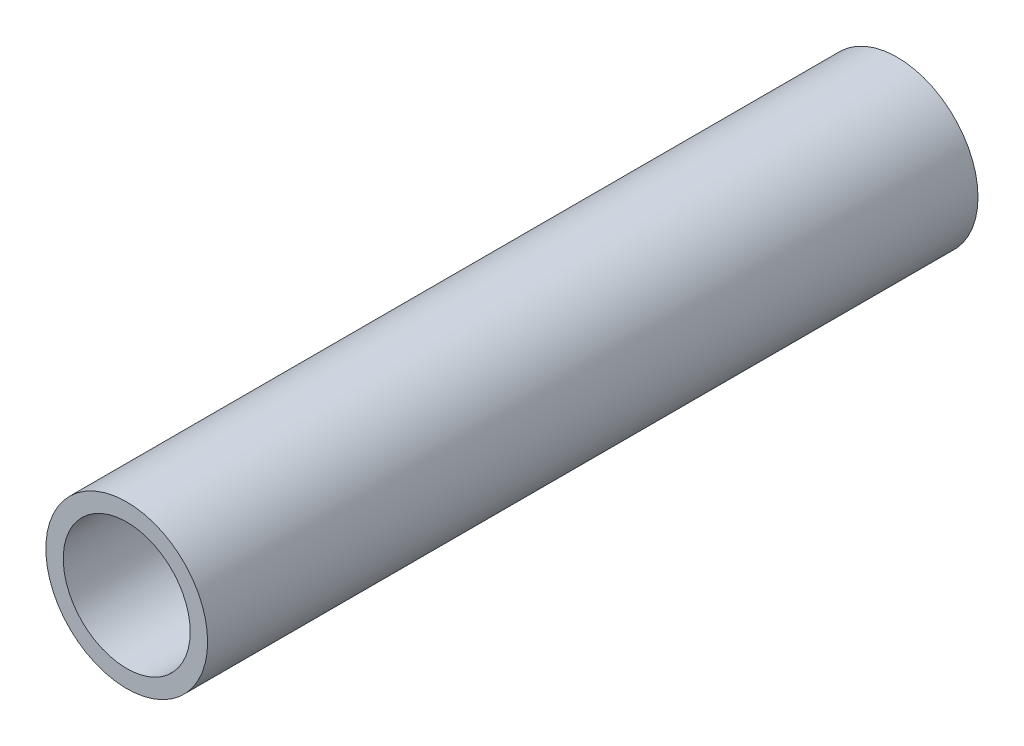
ISO-10303-21;
HEADER;
FILE_DESCRIPTION(('STEP AP214'),'2;1');
FILE_NAME('part.step','',(''),(''),'','','');
FILE_SCHEMA(('AUTOMOTIVE_DESIGN { 1 0 10303 214 1 1 1 1 }'));
ENDSEC;
DATA;
#1=APPLICATION_CONTEXT('core data for automotive mechanical design processes');
#2=APPLICATION_PROTOCOL_DEFINITION('international standard','automotive_design',2000,#1);
#3=PRODUCT_CONTEXT('',#1,'mechanical');
#4=PRODUCT('Part','Part','',(#3));
#5=PRODUCT_RELATED_PRODUCT_CATEGORY('part','',(#4));
#6=PRODUCT_DEFINITION_FORMATION('','',#4);
#7=PRODUCT_DEFINITION_CONTEXT('part definition',#1,'design');
#8=PRODUCT_DEFINITION('design','',#6,#7);
#9=PRODUCT_DEFINITION_SHAPE('','',#8);
#10=(LENGTH_UNIT() NAMED_UNIT(*) SI_UNIT(.MILLI.,.METRE.));
#11=(NAMED_UNIT(*) PLANE_ANGLE_UNIT() SI_UNIT($,.RADIAN.));
#12=(NAMED_UNIT(*) SI_UNIT($,.STERADIAN.) SOLID_ANGLE_UNIT());
#13=UNCERTAINTY_MEASURE_WITH_UNIT(LENGTH_MEASURE(1.E-05),#10,'distance_accuracy_value','');
#14=(GEOMETRIC_REPRESENTATION_CONTEXT(3) GLOBAL_UNCERTAINTY_ASSIGNED_CONTEXT((#13)) GLOBAL_UNIT_ASSIGNED_CONTEXT((#10,
#11,#12)) REPRESENTATION_CONTEXT('',''));
#15=CARTESIAN_POINT('',(0.,0.,0.));
#16=DIRECTION('',(0.,0.,1.));
#17=DIRECTION('',(1.,0.,0.));
#18=AXIS2_PLACEMENT_3D('',#15,#16,#17);
#19=CARTESIAN_POINT('',(0.,0.,127.));
#20=DIRECTION('',(0.,0.,1.));
#21=DIRECTION('',(1.,0.,0.));
#22=AXIS2_PLACEMENT_3D('',#19,#20,#21);
#23=PLANE('',#22);
#24=CARTESIAN_POINT('',(0.,0.,127.));
#25=DIRECTION('',(0.,0.,1.));
#26=DIRECTION('',(1.,0.,0.));
#27=AXIS2_PLACEMENT_3D('',#24,#25,#26);
#28=CIRCLE('',#27,13.335);
#29=CARTESIAN_POINT('',(13.335,0.,127.));
#30=VERTEX_POINT('',#29);
#31=EDGE_CURVE('E10',#30,#30,#28,.T.);
#32=ORIENTED_EDGE('',*,*,#31,.T.);
#33=EDGE_LOOP('',(#32));
#34=FACE_BOUND('',#33,.T.);
#35=CARTESIAN_POINT('',(0.,0.,127.));
#36=DIRECTION('',(0.,0.,1.));
#37=DIRECTION('',(1.,0.,0.));
#38=AXIS2_PLACEMENT_3D('',#35,#36,#37);
#39=CIRCLE('',#38,10.4648);
#40=CARTESIAN_POINT('',(10.4648,0.,127.));
#41=VERTEX_POINT('',#40);
#42=EDGE_CURVE('E46',#41,#41,#39,.T.);
#43=ORIENTED_EDGE('',*,*,#42,.F.);
#44=EDGE_LOOP('',(#43));
#45=FACE_BOUND('',#44,.T.);
#46=ADVANCED_FACE('F35',(#34,#45),#23,.T.);
#47=CARTESIAN_POINT('',(0.,0.,0.));
#48=DIRECTION('',(0.,0.,1.));
#49=DIRECTION('',(1.,0.,0.));
#50=AXIS2_PLACEMENT_3D('',#47,#48,#49);
#51=PLANE('',#50);
#52=CARTESIAN_POINT('',(0.,0.,0.));
#53=DIRECTION('',(0.,0.,1.));
#54=DIRECTION('',(1.,0.,0.));
#55=AXIS2_PLACEMENT_3D('',#52,#53,#54);
#56=CIRCLE('',#55,13.335);
#57=CARTESIAN_POINT('',(13.335,0.,0.));
#58=VERTEX_POINT('',#57);
#59=EDGE_CURVE('E39',#58,#58,#56,.T.);
#60=ORIENTED_EDGE('',*,*,#59,.F.);
#61=EDGE_LOOP('',(#60));
#62=FACE_BOUND('',#61,.T.);
#63=CARTESIAN_POINT('',(0.,0.,0.));
#64=DIRECTION('',(0.,0.,1.));
#65=DIRECTION('',(1.,0.,0.));
#66=AXIS2_PLACEMENT_3D('',#63,#64,#65);
#67=CIRCLE('',#66,10.4648);
#68=CARTESIAN_POINT('',(10.4648,0.,0.));
#69=VERTEX_POINT('',#68);
#70=EDGE_CURVE('E48',#69,#69,#67,.T.);
#71=ORIENTED_EDGE('',*,*,#70,.T.);
#72=EDGE_LOOP('',(#71));
#73=FACE_BOUND('',#72,.T.);
#74=ADVANCED_FACE('F58',(#62,#73),#51,.F.);
#75=CARTESIAN_POINT('',(0.,0.,127.));
#76=DIRECTION('',(0.,0.,-1.));
#77=DIRECTION('',(-1.,0.,0.));
#78=AXIS2_PLACEMENT_3D('',#75,#76,#77);
#79=CYLINDRICAL_SURFACE('',#78,13.335);
#80=ORIENTED_EDGE('',*,*,#31,.F.);
#81=EDGE_LOOP('',(#80));
#82=FACE_BOUND('',#81,.T.);
#83=ORIENTED_EDGE('',*,*,#59,.T.);
#84=EDGE_LOOP('',(#83));
#85=FACE_BOUND('',#84,.T.);
#86=ADVANCED_FACE('F37',(#82,#85),#79,.T.);
#87=CARTESIAN_POINT('',(0.,0.,127.));
#88=DIRECTION('',(0.,0.,-1.));
#89=DIRECTION('',(-1.,0.,0.));
#90=AXIS2_PLACEMENT_3D('',#87,#88,#89);
#91=CYLINDRICAL_SURFACE('',#90,10.4648);
#92=ORIENTED_EDGE('',*,*,#42,.T.);
#93=EDGE_LOOP('',(#92));
#94=FACE_BOUND('',#93,.T.);
#95=ORIENTED_EDGE('',*,*,#70,.F.);
#96=EDGE_LOOP('',(#95));
#97=FACE_BOUND('',#96,.T.);
#98=ADVANCED_FACE('F54',(#94,#97),#91,.F.);
#99=CLOSED_SHELL('',(#46,#74,#86,#98));
#100=MANIFOLD_SOLID_BREP('B2',#99);
#101=ADVANCED_BREP_SHAPE_REPRESENTATION('',(#18,#100),#14);
#102=SHAPE_DEFINITION_REPRESENTATION(#9,#101);
ENDSEC;
END-ISO-10303-21;
